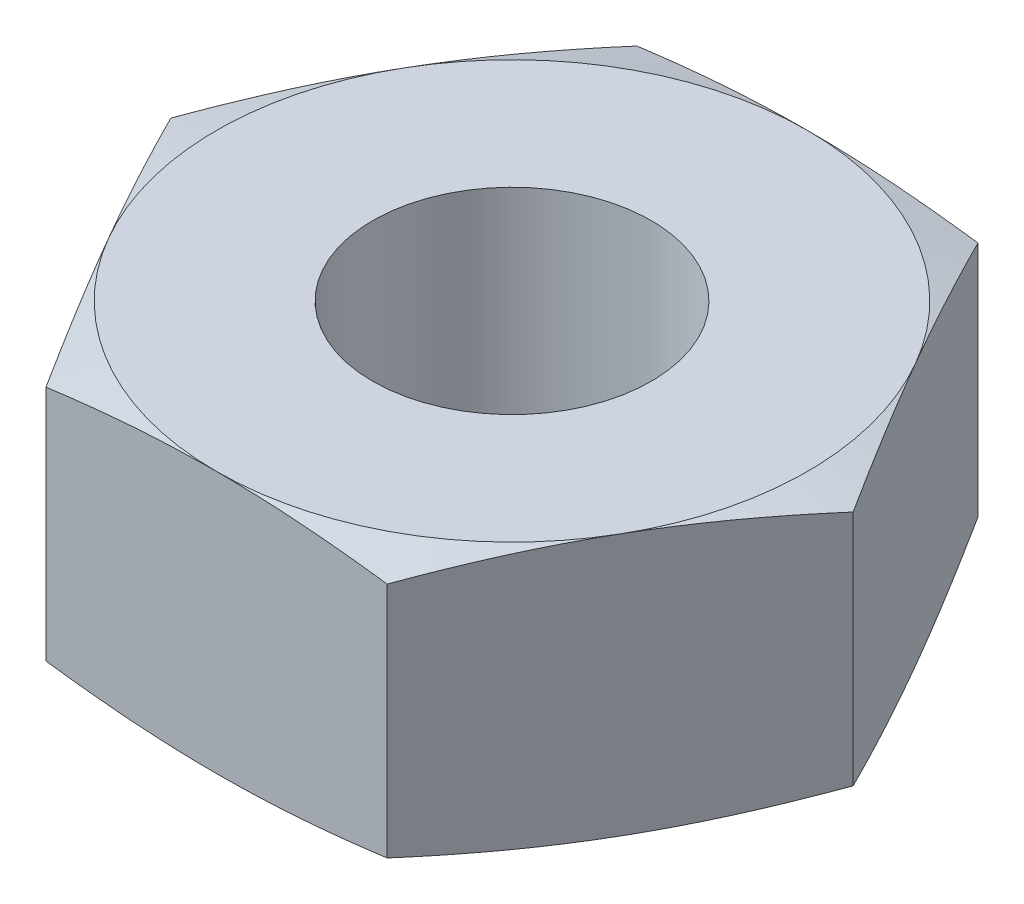
ISO-10303-21;
HEADER;
FILE_DESCRIPTION(('STEP AP214'),'2;1');
FILE_NAME('part.step','',(''),(''),'','','');
FILE_SCHEMA(('AUTOMOTIVE_DESIGN { 1 0 10303 214 1 1 1 1 }'));
ENDSEC;
DATA;
#1=APPLICATION_CONTEXT('core data for automotive mechanical design processes');
#2=APPLICATION_PROTOCOL_DEFINITION('international standard','automotive_design',2000,#1);
#3=PRODUCT_CONTEXT('',#1,'mechanical');
#4=PRODUCT('Part','Part','',(#3));
#5=PRODUCT_RELATED_PRODUCT_CATEGORY('part','',(#4));
#6=PRODUCT_DEFINITION_FORMATION('','',#4);
#7=PRODUCT_DEFINITION_CONTEXT('part definition',#1,'design');
#8=PRODUCT_DEFINITION('design','',#6,#7);
#9=PRODUCT_DEFINITION_SHAPE('','',#8);
#10=(LENGTH_UNIT() NAMED_UNIT(*) SI_UNIT(.MILLI.,.METRE.));
#11=(NAMED_UNIT(*) PLANE_ANGLE_UNIT() SI_UNIT($,.RADIAN.));
#12=(NAMED_UNIT(*) SI_UNIT($,.STERADIAN.) SOLID_ANGLE_UNIT());
#13=UNCERTAINTY_MEASURE_WITH_UNIT(LENGTH_MEASURE(1.E-05),#10,'distance_accuracy_value','');
#14=(GEOMETRIC_REPRESENTATION_CONTEXT(3) GLOBAL_UNCERTAINTY_ASSIGNED_CONTEXT((#13)) GLOBAL_UNIT_ASSIGNED_CONTEXT((#10,
#11,#12)) REPRESENTATION_CONTEXT('',''));
#15=CARTESIAN_POINT('',(0.,0.,0.));
#16=DIRECTION('',(0.,0.,1.));
#17=DIRECTION('',(1.,0.,0.));
#18=AXIS2_PLACEMENT_3D('',#15,#16,#17);
#19=CARTESIAN_POINT('',(0.,3.1,0.));
#20=DIRECTION('',(0.,1.,0.));
#21=DIRECTION('',(0.,0.,1.));
#22=AXIS2_PLACEMENT_3D('',#19,#20,#21);
#23=PLANE('',#22);
#24=CARTESIAN_POINT('',(0.,3.1,0.));
#25=DIRECTION('',(0.,1.,0.));
#26=DIRECTION('',(0.,0.,1.));
#27=AXIS2_PLACEMENT_3D('',#24,#25,#26);
#28=CIRCLE('',#27,1.64999999999999);
#29=CARTESIAN_POINT('',(0.,3.1,1.64999999999999));
#30=VERTEX_POINT('',#29);
#31=EDGE_CURVE('E259',#30,#30,#28,.T.);
#32=ORIENTED_EDGE('',*,*,#31,.F.);
#33=EDGE_LOOP('',(#32));
#34=FACE_BOUND('',#33,.T.);
#35=CARTESIAN_POINT('',(0.,3.1,0.));
#36=DIRECTION('',(0.,1.,0.));
#37=DIRECTION('',(0.,0.,1.));
#38=AXIS2_PLACEMENT_3D('',#35,#36,#37);
#39=CIRCLE('',#38,3.49999999999996);
#40=CARTESIAN_POINT('',(0.,3.1,3.49999999999996));
#41=VERTEX_POINT('',#40);
#42=CARTESIAN_POINT('',(-3.03108891324549,3.1,1.75));
#43=VERTEX_POINT('',#42);
#44=EDGE_CURVE('E11',#41,#43,#39,.F.);
#45=ORIENTED_EDGE('',*,*,#44,.F.);
#46=CARTESIAN_POINT('',(0.,3.1,0.));
#47=DIRECTION('',(0.,1.,0.));
#48=DIRECTION('',(0.,0.,1.));
#49=AXIS2_PLACEMENT_3D('',#46,#47,#48);
#50=CIRCLE('',#49,3.49999999999996);
#51=CARTESIAN_POINT('',(3.03108891324551,3.1,1.74999999999996));
#52=VERTEX_POINT('',#51);
#53=EDGE_CURVE('E158',#41,#52,#50,.T.);
#54=ORIENTED_EDGE('',*,*,#53,.T.);
#55=CARTESIAN_POINT('',(3.0310889132455,3.1,-1.74999999999998));
#56=VERTEX_POINT('',#55);
#57=EDGE_CURVE('E52',#56,#52,#39,.F.);
#58=ORIENTED_EDGE('',*,*,#57,.F.);
#59=CARTESIAN_POINT('',(0.,3.1,-3.49999999999996));
#60=VERTEX_POINT('',#59);
#61=EDGE_CURVE('E283',#60,#56,#39,.F.);
#62=ORIENTED_EDGE('',*,*,#61,.F.);
#63=CARTESIAN_POINT('',(-3.03108891324551,3.1,-1.74999999999996));
#64=VERTEX_POINT('',#63);
#65=EDGE_CURVE('E326',#64,#60,#39,.F.);
#66=ORIENTED_EDGE('',*,*,#65,.F.);
#67=EDGE_CURVE('E55',#43,#64,#39,.F.);
#68=ORIENTED_EDGE('',*,*,#67,.F.);
#69=EDGE_LOOP('',(#45,#54,#58,#62,#66,#68));
#70=FACE_BOUND('',#69,.T.);
#71=ADVANCED_FACE('F43',(#34,#70),#23,.T.);
#72=CARTESIAN_POINT('',(0.,0.,0.));
#73=DIRECTION('',(0.,1.,0.));
#74=DIRECTION('',(0.,0.,1.));
#75=AXIS2_PLACEMENT_3D('',#72,#73,#74);
#76=PLANE('',#75);
#77=CARTESIAN_POINT('',(0.,0.,0.));
#78=DIRECTION('',(0.,1.,0.));
#79=DIRECTION('',(0.,0.,1.));
#80=AXIS2_PLACEMENT_3D('',#77,#78,#79);
#81=CIRCLE('',#80,1.65);
#82=CARTESIAN_POINT('',(0.,0.,1.65));
#83=VERTEX_POINT('',#82);
#84=EDGE_CURVE('E265',#83,#83,#81,.T.);
#85=ORIENTED_EDGE('',*,*,#84,.T.);
#86=EDGE_LOOP('',(#85));
#87=FACE_BOUND('',#86,.T.);
#88=CARTESIAN_POINT('',(0.,0.,0.));
#89=DIRECTION('',(0.,1.,0.));
#90=DIRECTION('',(0.,0.,1.));
#91=AXIS2_PLACEMENT_3D('',#88,#89,#90);
#92=CIRCLE('',#91,3.49999999999996);
#93=CARTESIAN_POINT('',(0.,0.,3.49999999999996));
#94=VERTEX_POINT('',#93);
#95=CARTESIAN_POINT('',(3.03108891324551,0.,1.74999999999996));
#96=VERTEX_POINT('',#95);
#97=EDGE_CURVE('E151',#94,#96,#92,.T.);
#98=ORIENTED_EDGE('',*,*,#97,.F.);
#99=CARTESIAN_POINT('',(0.,0.,0.));
#100=DIRECTION('',(0.,1.,0.));
#101=DIRECTION('',(0.,0.,1.));
#102=AXIS2_PLACEMENT_3D('',#99,#100,#101);
#103=CIRCLE('',#102,3.49999999999996);
#104=CARTESIAN_POINT('',(-3.03108891324549,0.,1.75));
#105=VERTEX_POINT('',#104);
#106=EDGE_CURVE('E164',#94,#105,#103,.F.);
#107=ORIENTED_EDGE('',*,*,#106,.T.);
#108=CARTESIAN_POINT('',(-3.03108891324551,0.,-1.74999999999996));
#109=VERTEX_POINT('',#108);
#110=EDGE_CURVE('E279',#105,#109,#103,.F.);
#111=ORIENTED_EDGE('',*,*,#110,.T.);
#112=CARTESIAN_POINT('',(0.,0.,-3.49999999999996));
#113=VERTEX_POINT('',#112);
#114=EDGE_CURVE('E284',#109,#113,#103,.F.);
#115=ORIENTED_EDGE('',*,*,#114,.T.);
#116=CARTESIAN_POINT('',(3.0310889132455,0.,-1.74999999999998));
#117=VERTEX_POINT('',#116);
#118=EDGE_CURVE('E162',#113,#117,#103,.F.);
#119=ORIENTED_EDGE('',*,*,#118,.T.);
#120=EDGE_CURVE('E137',#117,#96,#103,.F.);
#121=ORIENTED_EDGE('',*,*,#120,.T.);
#122=EDGE_LOOP('',(#98,#107,#111,#115,#119,#121));
#123=FACE_BOUND('',#122,.T.);
#124=ADVANCED_FACE('F159',(#87,#123),#76,.F.);
#125=CARTESIAN_POINT('',(0.,3.1,0.));
#126=DIRECTION('',(0.,1.,0.));
#127=DIRECTION('',(0.,0.,1.));
#128=AXIS2_PLACEMENT_3D('',#125,#126,#127);
#129=CYLINDRICAL_SURFACE('',#128,1.64999999999999);
#130=ORIENTED_EDGE('',*,*,#84,.F.);
#131=EDGE_LOOP('',(#130));
#132=FACE_BOUND('',#131,.T.);
#133=ORIENTED_EDGE('',*,*,#31,.T.);
#134=EDGE_LOOP('',(#133));
#135=FACE_BOUND('',#134,.T.);
#136=ADVANCED_FACE('F194',(#132,#135),#129,.F.);
#137=CARTESIAN_POINT('',(0.,0.,0.));
#138=DIRECTION('',(0.,1.,0.));
#139=DIRECTION('',(0.,0.,1.));
#140=AXIS2_PLACEMENT_3D('',#137,#138,#139);
#141=CONICAL_SURFACE('',#140,3.49999999999996,1.30899693899574);
#142=CARTESIAN_POINT('',(-6.06936230178933,0.939489583560413,3.50000000000004));
#143=CARTESIAN_POINT('',(-5.92224769274745,0.905344318494395,3.50000000000004));
#144=CARTESIAN_POINT('',(-5.77506619218543,0.871486976113389,3.50000000000004));
#145=CARTESIAN_POINT('',(-5.48054165265175,0.804471372598283,3.50000000000004));
#146=CARTESIAN_POINT('',(-5.33319861103691,0.771313123088021,3.50000000000003));
#147=CARTESIAN_POINT('',(-4.89083417403673,0.673060526400826,3.50000000000003));
#148=CARTESIAN_POINT('',(-4.59553602106016,0.609202024899264,3.50000000000003));
#149=CARTESIAN_POINT('',(-4.00119204225972,0.485690742503001,3.50000000000002));
#150=CARTESIAN_POINT('',(-3.70213686331737,0.426082473534192,3.50000000000002));
#151=CARTESIAN_POINT('',(-3.10262873214497,0.314105604446441,3.50000000000001));
#152=CARTESIAN_POINT('',(-2.80217566358384,0.261737618413204,3.50000000000001));
#153=CARTESIAN_POINT('',(-2.20761813128422,0.169129619955442,3.5));
#154=CARTESIAN_POINT('',(-1.9135604689667,0.128601099741144,3.5));
#155=CARTESIAN_POINT('',(-1.47125654963096,0.0788585917058612,3.49999999999999));
#156=CARTESIAN_POINT('',(-1.32363227147206,0.0641202924406588,3.49999999999999));
#157=CARTESIAN_POINT('',(-1.02802479009862,0.0388962059702481,3.49999999999999));
#158=CARTESIAN_POINT('',(-0.880041612260892,0.028410126441191,3.49999999999999));
#159=CARTESIAN_POINT('',(-0.584449855969166,0.0121988349986269,3.49999999999999));
#160=CARTESIAN_POINT('',(-0.436842406962712,0.00645332437112175,3.49999999999998));
#161=CARTESIAN_POINT('',(-0.141516452491127,-6.21610861985006E-05,3.49999999999998));
#162=CARTESIAN_POINT('',(0.00620205248960651,-0.000832157493449603,3.49999999999998));
#163=CARTESIAN_POINT('',(0.301590554005556,0.00264446135592434,3.49999999999998));
#164=CARTESIAN_POINT('',(0.449260545979386,0.00689145940010209,3.49999999999998));
#165=CARTESIAN_POINT('',(0.744379521136856,0.0201822690380688,3.49999999999997));
#166=CARTESIAN_POINT('',(0.891828504561848,0.0292260753896956,3.49999999999997));
#167=CARTESIAN_POINT('',(1.24925494939193,0.056485064839163,3.49999999999997));
#168=CARTESIAN_POINT('',(1.45905949358602,0.076967211157635,3.49999999999996));
#169=CARTESIAN_POINT('',(1.87779262285002,0.12524039519469,3.49999999999996));
#170=CARTESIAN_POINT('',(2.0867212428909,0.1530311382419,3.49999999999996));
#171=CARTESIAN_POINT('',(2.50437827739807,0.214400079258007,3.49999999999995));
#172=CARTESIAN_POINT('',(2.71310404792876,0.247996009355105,3.49999999999995));
#173=CARTESIAN_POINT('',(3.12980884372102,0.319545462621682,3.49999999999995));
#174=CARTESIAN_POINT('',(3.33778783203112,0.357499198436848,3.49999999999995));
#175=CARTESIAN_POINT('',(3.75735674163426,0.437505770709711,3.49999999999994));
#176=CARTESIAN_POINT('',(3.96893361460638,0.47962651693829,3.49999999999994));
#177=CARTESIAN_POINT('',(4.39155544327137,0.566454026690071,3.49999999999993));
#178=CARTESIAN_POINT('',(4.60260039313308,0.611160818434961,3.49999999999993));
#179=CARTESIAN_POINT('',(5.02313048588161,0.702293378803934,3.49999999999993));
#180=CARTESIAN_POINT('',(5.23261791923147,0.748708627882237,3.49999999999993));
#181=CARTESIAN_POINT('',(5.65123489196765,0.843061271383624,3.49999999999992));
#182=CARTESIAN_POINT('',(5.86036445530282,0.890998559388443,3.49999999999992));
#183=CARTESIAN_POINT('',(6.0693623017894,0.939489583560413,3.49999999999992));
#184=B_SPLINE_CURVE_WITH_KNOTS('',3,(#142,#143,#144,#145,#146,#147,#148,#149,#150,#151,#152,
#153,#154,#155,#156,#157,#158,#159,#160,#161,#162,#163,#164,#165,#166,#167,#168,#169,#170,#171,
#172,#173,#174,#175,#176,#177,#178,#179,#180,#181,#182,#183),.UNSPECIFIED.,.F.,.F.,(4,2,2,2,2,2,
2,2,2,2,2,2,2,2,2,2,2,2,2,2,4),(0.,0.453075080699115,0.906157688759068,1.81250329996458,
2.72725701533054,3.64208826814007,4.53229490655777,4.97731857908019,5.42231165273799,
5.86538926771751,6.30846496119006,6.7515744627158,7.19468347999309,7.82691859199109,
8.45912821714922,9.09330423248992,9.72751120656554,10.3746766371492,11.0218491316251,
11.6655464761794,12.3091989132365),.UNSPECIFIED.);
#185=CARTESIAN_POINT('',(2.02072594216372,0.145081595145839,3.49999999999996));
#186=VERTEX_POINT('',#185);
#187=EDGE_CURVE('E152',#94,#186,#184,.T.);
#188=ORIENTED_EDGE('',*,*,#187,.F.);
#189=ORIENTED_EDGE('',*,*,#97,.T.);
#190=CARTESIAN_POINT('',(2.02061047210988,0.145112536579482,3.50019999999996));
#191=CARTESIAN_POINT('',(2.10453570366725,0.122614406177996,3.35483723490561));
#192=CARTESIAN_POINT('',(2.18861311055534,0.102189745494032,3.20921089440679));
#193=CARTESIAN_POINT('',(2.35706487716361,0.0663054466052739,2.91744387601653));
#194=CARTESIAN_POINT('',(2.44143934349253,0.0508478254944838,2.77130301347333));
#195=CARTESIAN_POINT('',(2.60997361780492,0.025800087746425,2.47939308754753));
#196=CARTESIAN_POINT('',(2.69413228593379,0.0161800979095285,2.333625998451));
#197=CARTESIAN_POINT('',(2.86255695641053,0.00328066753314792,2.04190591193723));
#198=CARTESIAN_POINT('',(2.94682293482803,0.,1.89595295596861));
#199=CARTESIAN_POINT('',(3.11535489166305,0.,1.60404704403135));
#200=CARTESIAN_POINT('',(3.19962087008056,0.00328066753314791,1.45809408806273));
#201=CARTESIAN_POINT('',(3.36804554055729,0.0161800979095285,1.16637400154896));
#202=CARTESIAN_POINT('',(3.45220420868616,0.0258000877464251,1.02060691245243));
#203=CARTESIAN_POINT('',(3.62073848299855,0.0508478254944839,0.728696986526628));
#204=CARTESIAN_POINT('',(3.70511294932747,0.0663054466052739,0.582556123983431));
#205=CARTESIAN_POINT('',(3.87356471593574,0.102189745494032,0.290789105593169));
#206=CARTESIAN_POINT('',(3.95764212282383,0.122614406177996,0.145162765094345));
#207=CARTESIAN_POINT('',(4.0415673543812,0.145112536579482,-0.000200000000000002));
#208=B_SPLINE_CURVE_WITH_KNOTS('',3,(#190,#191,#192,#193,#194,#195,#196,#197,#198,#199,#200,
#201,#202,#203,#204,#205,#206,#207),.UNSPECIFIED.,.F.,.F.,(4,2,2,2,2,2,2,2,4),(0.,
0.508081243376826,1.01636855642798,1.52203235492773,2.02759827097031,2.53316418701288,
3.03882798551263,3.54711529856379,4.05519654194061),.UNSPECIFIED.);
#209=EDGE_CURVE('E148',#186,#96,#208,.T.);
#210=ORIENTED_EDGE('',*,*,#209,.F.);
#211=EDGE_LOOP('',(#188,#189,#210));
#212=FACE_BOUND('',#211,.T.);
#213=ADVANCED_FACE('F155',(#212),#141,.T.);
#214=ORIENTED_EDGE('',*,*,#120,.F.);
#215=CARTESIAN_POINT('',(4.0415673543812,0.145112536579482,0.000200000000000051));
#216=CARTESIAN_POINT('',(3.95764212282383,0.122614406177995,-0.145162765094346));
#217=CARTESIAN_POINT('',(3.87356471593573,0.102189745494031,-0.290789105593172));
#218=CARTESIAN_POINT('',(3.70511294932746,0.0663054466052719,-0.582556123983436));
#219=CARTESIAN_POINT('',(3.62073848299854,0.0508478254944814,-0.728696986526634));
#220=CARTESIAN_POINT('',(3.45220420868615,0.025800087746422,-1.02060691245244));
#221=CARTESIAN_POINT('',(3.36804554055728,0.0161800979095252,-1.16637400154897));
#222=CARTESIAN_POINT('',(3.19962087008053,0.00328066753314432,-1.45809408806274));
#223=CARTESIAN_POINT('',(3.11535489166303,0.,-1.60404704403137));
#224=CARTESIAN_POINT('',(2.94682293482801,0.,-1.89595295596862));
#225=CARTESIAN_POINT('',(2.8625569564105,0.0032806675331443,-2.04190591193725));
#226=CARTESIAN_POINT('',(2.69413228593375,0.0161800979095252,-2.33362599845101));
#227=CARTESIAN_POINT('',(2.60997361780488,0.025800087746422,-2.47939308754755));
#228=CARTESIAN_POINT('',(2.44143934349249,0.0508478254944814,-2.77130301347335));
#229=CARTESIAN_POINT('',(2.35706487716357,0.066305446605272,-2.91744387601655));
#230=CARTESIAN_POINT('',(2.1886131105553,0.102189745494031,-3.20921089440682));
#231=CARTESIAN_POINT('',(2.1045357036672,0.122614406177995,-3.35483723490564));
#232=CARTESIAN_POINT('',(2.02061047210983,0.145112536579482,-3.50019999999999));
#233=B_SPLINE_CURVE_WITH_KNOTS('',3,(#215,#216,#217,#218,#219,#220,#221,#222,#223,#224,#225,
#226,#227,#228,#229,#230,#231,#232),.UNSPECIFIED.,.F.,.F.,(4,2,2,2,2,2,2,2,4),(0.,
0.508081243376832,1.01636855642799,1.52203235492775,2.02759827097033,2.53316418701291,
3.03882798551267,3.54711529856383,4.05519654194066),.UNSPECIFIED.);
#234=CARTESIAN_POINT('',(4.04145188432736,0.145081595145839,0.));
#235=VERTEX_POINT('',#234);
#236=EDGE_CURVE('E143',#235,#117,#233,.T.);
#237=ORIENTED_EDGE('',*,*,#236,.F.);
#238=EDGE_CURVE('E135',#96,#235,#208,.T.);
#239=ORIENTED_EDGE('',*,*,#238,.F.);
#240=EDGE_LOOP('',(#214,#237,#239));
#241=FACE_BOUND('',#240,.T.);
#242=ADVANCED_FACE('F136',(#241),#141,.T.);
#243=ORIENTED_EDGE('',*,*,#118,.F.);
#244=CARTESIAN_POINT('',(6.06936230178935,0.939489583560413,-3.5));
#245=CARTESIAN_POINT('',(5.92224769274747,0.905344318494396,-3.5));
#246=CARTESIAN_POINT('',(5.77506619218546,0.871486976113389,-3.5));
#247=CARTESIAN_POINT('',(5.48054165265177,0.804471372598283,-3.5));
#248=CARTESIAN_POINT('',(5.33319861103694,0.771313123088021,-3.5));
#249=CARTESIAN_POINT('',(4.89083417403676,0.673060526400826,-3.5));
#250=CARTESIAN_POINT('',(4.59553602106018,0.609202024899264,-3.5));
#251=CARTESIAN_POINT('',(4.00119204225974,0.485690742503002,-3.49999999999999));
#252=CARTESIAN_POINT('',(3.7021368633174,0.426082473534193,-3.49999999999999));
#253=CARTESIAN_POINT('',(3.102628732145,0.314105604446442,-3.49999999999999));
#254=CARTESIAN_POINT('',(2.80217566358387,0.261737618413204,-3.49999999999999));
#255=CARTESIAN_POINT('',(2.20761813128425,0.169129619955442,-3.49999999999999));
#256=CARTESIAN_POINT('',(1.91356046896673,0.128601099741144,-3.49999999999999));
#257=CARTESIAN_POINT('',(1.47125654963098,0.0788585917058615,-3.49999999999999));
#258=CARTESIAN_POINT('',(1.32363227147209,0.0641202924406591,-3.49999999999998));
#259=CARTESIAN_POINT('',(1.02802479009864,0.0388962059702484,-3.49999999999998));
#260=CARTESIAN_POINT('',(0.880041612260917,0.0284101264411912,-3.49999999999998));
#261=CARTESIAN_POINT('',(0.584449855969191,0.012198834998627,-3.49999999999998));
#262=CARTESIAN_POINT('',(0.436842406962736,0.00645332437112183,-3.49999999999998));
#263=CARTESIAN_POINT('',(0.141516452491151,-6.21610861983845E-05,-3.49999999999998));
#264=CARTESIAN_POINT('',(-0.00620205248958201,-0.000832157493449399,-3.49999999999998));
#265=CARTESIAN_POINT('',(-0.301590554005532,0.0026444613559246,-3.49999999999998));
#266=CARTESIAN_POINT('',(-0.449260545979362,0.00689145940010233,-3.49999999999998));
#267=CARTESIAN_POINT('',(-0.744379521136833,0.020182269038069,-3.49999999999998));
#268=CARTESIAN_POINT('',(-0.891828504561824,0.0292260753896958,-3.49999999999998));
#269=CARTESIAN_POINT('',(-1.24925494939191,0.0564850648391631,-3.49999999999998));
#270=CARTESIAN_POINT('',(-1.45905949358599,0.076967211157635,-3.49999999999998));
#271=CARTESIAN_POINT('',(-1.87779262284999,0.125240395194691,-3.49999999999997));
#272=CARTESIAN_POINT('',(-2.08672124289087,0.153031138241901,-3.49999999999997));
#273=CARTESIAN_POINT('',(-2.50437827739804,0.214400079258007,-3.49999999999997));
#274=CARTESIAN_POINT('',(-2.71310404792874,0.247996009355105,-3.49999999999997));
#275=CARTESIAN_POINT('',(-3.129808843721,0.319545462621682,-3.49999999999997));
#276=CARTESIAN_POINT('',(-3.33778783203109,0.357499198436848,-3.49999999999997));
#277=CARTESIAN_POINT('',(-3.75735674163423,0.437505770709712,-3.49999999999997));
#278=CARTESIAN_POINT('',(-3.96893361460636,0.47962651693829,-3.49999999999997));
#279=CARTESIAN_POINT('',(-4.39155544327135,0.566454026690071,-3.49999999999997));
#280=CARTESIAN_POINT('',(-4.60260039313306,0.611160818434961,-3.49999999999996));
#281=CARTESIAN_POINT('',(-5.02313048588159,0.702293378803933,-3.49999999999996));
#282=CARTESIAN_POINT('',(-5.23261791923145,0.748708627882236,-3.49999999999996));
#283=CARTESIAN_POINT('',(-5.65123489196763,0.843061271383625,-3.49999999999996));
#284=CARTESIAN_POINT('',(-5.86036445530279,0.890998559388444,-3.49999999999996));
#285=CARTESIAN_POINT('',(-6.06936230178938,0.939489583560413,-3.49999999999996));
#286=B_SPLINE_CURVE_WITH_KNOTS('',3,(#244,#245,#246,#247,#248,#249,#250,#251,#252,#253,#254,
#255,#256,#257,#258,#259,#260,#261,#262,#263,#264,#265,#266,#267,#268,#269,#270,#271,#272,#273,
#274,#275,#276,#277,#278,#279,#280,#281,#282,#283,#284,#285),.UNSPECIFIED.,.F.,.F.,(4,2,2,2,2,2,
2,2,2,2,2,2,2,2,2,2,2,2,2,2,4),(0.,0.453075080699114,0.906157688759067,1.81250329996458,
2.72725701533054,3.64208826814007,4.53229490655777,4.97731857908019,5.42231165273799,
5.86538926771751,6.30846496119006,6.7515744627158,7.19468347999309,7.82691859199109,
8.45912821714922,9.09330423248992,9.72751120656554,10.3746766371492,11.0218491316251,
11.6655464761794,12.3091989132365),.UNSPECIFIED.);
#287=CARTESIAN_POINT('',(2.02072594216367,0.145081595145839,-3.49999999999999));
#288=VERTEX_POINT('',#287);
#289=EDGE_CURVE('E235',#288,#113,#286,.T.);
#290=ORIENTED_EDGE('',*,*,#289,.F.);
#291=EDGE_CURVE('E179',#117,#288,#233,.T.);
#292=ORIENTED_EDGE('',*,*,#291,.F.);
#293=EDGE_LOOP('',(#243,#290,#292));
#294=FACE_BOUND('',#293,.T.);
#295=ADVANCED_FACE('F348',(#294),#141,.T.);
#296=ORIENTED_EDGE('',*,*,#114,.F.);
#297=CARTESIAN_POINT('',(-2.02061047210986,0.145112536579482,-3.50019999999997));
#298=CARTESIAN_POINT('',(-2.10453570366723,0.122614406177996,-3.35483723490563));
#299=CARTESIAN_POINT('',(-2.18861311055532,0.102189745494031,-3.2092108944068));
#300=CARTESIAN_POINT('',(-2.35706487716359,0.066305446605272,-2.91744387601654));
#301=CARTESIAN_POINT('',(-2.44143934349251,0.0508478254944814,-2.77130301347334));
#302=CARTESIAN_POINT('',(-2.6099736178049,0.0258000877464219,-2.47939308754753));
#303=CARTESIAN_POINT('',(-2.69413228593377,0.0161800979095251,-2.333625998451));
#304=CARTESIAN_POINT('',(-2.86255695641051,0.00328066753314416,-2.04190591193723));
#305=CARTESIAN_POINT('',(-2.94682293482802,0.,-1.8959529559686));
#306=CARTESIAN_POINT('',(-3.11535489166304,0.,-1.60404704403134));
#307=CARTESIAN_POINT('',(-3.19962087008054,0.00328066753314411,-1.45809408806272));
#308=CARTESIAN_POINT('',(-3.36804554055729,0.016180097909525,-1.16637400154895));
#309=CARTESIAN_POINT('',(-3.45220420868616,0.0258000877464219,-1.02060691245242));
#310=CARTESIAN_POINT('',(-3.62073848299854,0.0508478254944813,-0.728696986526609));
#311=CARTESIAN_POINT('',(-3.70511294932746,0.0663054466052719,-0.58255612398341));
#312=CARTESIAN_POINT('',(-3.87356471593573,0.102189745494031,-0.290789105593145));
#313=CARTESIAN_POINT('',(-3.95764212282383,0.122614406177995,-0.145162765094319));
#314=CARTESIAN_POINT('',(-4.0415673543812,0.145112536579482,0.000200000000027788));
#315=B_SPLINE_CURVE_WITH_KNOTS('',3,(#297,#298,#299,#300,#301,#302,#303,#304,#305,#306,#307,
#308,#309,#310,#311,#312,#313,#314),.UNSPECIFIED.,.F.,.F.,(4,2,2,2,2,2,2,2,4),(0.,
0.508081243376832,1.01636855642799,1.52203235492775,2.02759827097033,2.53316418701291,
3.03882798551267,3.54711529856383,4.05519654194066),.UNSPECIFIED.);
#316=CARTESIAN_POINT('',(-2.0207259421637,0.145081595145839,-3.49999999999997));
#317=VERTEX_POINT('',#316);
#318=EDGE_CURVE('E232',#317,#109,#315,.T.);
#319=ORIENTED_EDGE('',*,*,#318,.F.);
#320=EDGE_CURVE('E223',#113,#317,#286,.T.);
#321=ORIENTED_EDGE('',*,*,#320,.F.);
#322=EDGE_LOOP('',(#296,#319,#321));
#323=FACE_BOUND('',#322,.T.);
#324=ADVANCED_FACE('F349',(#323),#141,.T.);
#325=ORIENTED_EDGE('',*,*,#110,.F.);
#326=CARTESIAN_POINT('',(-4.0415673543812,0.145112536579481,-0.000199999999971832));
#327=CARTESIAN_POINT('',(-3.95764212282383,0.122614406177995,0.145162765094373));
#328=CARTESIAN_POINT('',(-3.87356471593573,0.102189745494031,0.290789105593199));
#329=CARTESIAN_POINT('',(-3.70511294932745,0.0663054466052719,0.582556123983461));
#330=CARTESIAN_POINT('',(-3.62073848299853,0.0508478254944813,0.728696986526659));
#331=CARTESIAN_POINT('',(-3.45220420868614,0.0258000877464218,1.02060691245247));
#332=CARTESIAN_POINT('',(-3.36804554055727,0.016180097909525,1.166374001549));
#333=CARTESIAN_POINT('',(-3.19962087008052,0.00328066753314409,1.45809408806276));
#334=CARTESIAN_POINT('',(-3.11535489166301,0.,1.60404704403139));
#335=CARTESIAN_POINT('',(-2.94682293482799,0.,1.89595295596864));
#336=CARTESIAN_POINT('',(-2.86255695641048,0.00328066753314409,2.04190591193727));
#337=CARTESIAN_POINT('',(-2.69413228593374,0.016180097909525,2.33362599845103));
#338=CARTESIAN_POINT('',(-2.60997361780487,0.0258000877464219,2.47939308754756));
#339=CARTESIAN_POINT('',(-2.44143934349247,0.0508478254944814,2.77130301347337));
#340=CARTESIAN_POINT('',(-2.35706487716355,0.0663054466052719,2.91744387601657));
#341=CARTESIAN_POINT('',(-2.18861311055528,0.102189745494031,3.20921089440683));
#342=CARTESIAN_POINT('',(-2.10453570366718,0.122614406177995,3.35483723490566));
#343=CARTESIAN_POINT('',(-2.02061047210981,0.145112536579482,3.5002));
#344=B_SPLINE_CURVE_WITH_KNOTS('',3,(#326,#327,#328,#329,#330,#331,#332,#333,#334,#335,#336,
#337,#338,#339,#340,#341,#342,#343),.UNSPECIFIED.,.F.,.F.,(4,2,2,2,2,2,2,2,4),(0.,
0.508081243376832,1.01636855642799,1.52203235492775,2.02759827097033,2.53316418701291,
3.03882798551267,3.54711529856383,4.05519654194066),.UNSPECIFIED.);
#345=CARTESIAN_POINT('',(-4.04145188432736,0.145081595145839,0.));
#346=VERTEX_POINT('',#345);
#347=EDGE_CURVE('E350',#346,#105,#344,.T.);
#348=ORIENTED_EDGE('',*,*,#347,.F.);
#349=EDGE_CURVE('E218',#109,#346,#315,.T.);
#350=ORIENTED_EDGE('',*,*,#349,.F.);
#351=EDGE_LOOP('',(#325,#348,#350));
#352=FACE_BOUND('',#351,.T.);
#353=ADVANCED_FACE('F356',(#352),#141,.T.);
#354=ORIENTED_EDGE('',*,*,#106,.F.);
#355=CARTESIAN_POINT('',(-2.02072594216365,0.145081595145839,3.5));
#356=VERTEX_POINT('',#355);
#357=EDGE_CURVE('E344',#356,#94,#184,.T.);
#358=ORIENTED_EDGE('',*,*,#357,.F.);
#359=EDGE_CURVE('E211',#105,#356,#344,.T.);
#360=ORIENTED_EDGE('',*,*,#359,.F.);
#361=EDGE_LOOP('',(#354,#358,#360));
#362=FACE_BOUND('',#361,.T.);
#363=ADVANCED_FACE('F198',(#362),#141,.T.);
#364=CARTESIAN_POINT('',(0.,2.86229508922613,0.));
#365=DIRECTION('',(0.,-1.,0.));
#366=DIRECTION('',(0.,0.,-1.));
#367=AXIS2_PLACEMENT_3D('',#364,#365,#366);
#368=CONICAL_SURFACE('',#367,4.38712680421667,1.30899693899574);
#369=ORIENTED_EDGE('',*,*,#53,.F.);
#370=CARTESIAN_POINT('',(6.0693623017894,2.16051041643959,3.49999999999992));
#371=CARTESIAN_POINT('',(5.92224769274752,2.1946556815056,3.49999999999992));
#372=CARTESIAN_POINT('',(5.77506619218551,2.22851302388661,3.49999999999992));
#373=CARTESIAN_POINT('',(5.48054165265182,2.29552862740172,3.49999999999992));
#374=CARTESIAN_POINT('',(5.33319861103698,2.32868687691198,3.49999999999992));
#375=CARTESIAN_POINT('',(4.89083417403681,2.42693947359917,3.49999999999993));
#376=CARTESIAN_POINT('',(4.59553602106023,2.49079797510074,3.49999999999993));
#377=CARTESIAN_POINT('',(4.00119204225979,2.614309257497,3.49999999999994));
#378=CARTESIAN_POINT('',(3.70213686331745,2.67391752646581,3.49999999999994));
#379=CARTESIAN_POINT('',(3.10262873214505,2.78589439555356,3.49999999999995));
#380=CARTESIAN_POINT('',(2.80217566358392,2.8382623815868,3.49999999999995));
#381=CARTESIAN_POINT('',(2.20761813128429,2.93087038004456,3.49999999999996));
#382=CARTESIAN_POINT('',(1.91356046896678,2.97139890025886,3.49999999999996));
#383=CARTESIAN_POINT('',(1.47125654963103,3.02114140829414,3.49999999999996));
#384=CARTESIAN_POINT('',(1.32363227147213,3.03587970755934,3.49999999999997));
#385=CARTESIAN_POINT('',(1.02802479009869,3.06110379402975,3.49999999999997));
#386=CARTESIAN_POINT('',(0.880041612260965,3.07158987355881,3.49999999999997));
#387=CARTESIAN_POINT('',(0.584449855969238,3.08780116500137,3.49999999999997));
#388=CARTESIAN_POINT('',(0.436842406962784,3.09354667562888,3.49999999999998));
#389=CARTESIAN_POINT('',(0.141516452491198,3.1000621610862,3.49999999999998));
#390=CARTESIAN_POINT('',(-0.00620205248953463,3.10083215749345,3.49999999999998));
#391=CARTESIAN_POINT('',(-0.301590554005485,3.09735553864408,3.49999999999998));
#392=CARTESIAN_POINT('',(-0.449260545979314,3.0931085405999,3.49999999999998));
#393=CARTESIAN_POINT('',(-0.744379521136785,3.07981773096193,3.49999999999999));
#394=CARTESIAN_POINT('',(-0.891828504561777,3.07077392461031,3.49999999999999));
#395=CARTESIAN_POINT('',(-1.24925494939186,3.04351493516084,3.49999999999999));
#396=CARTESIAN_POINT('',(-1.45905949358595,3.02303278884237,3.49999999999999));
#397=CARTESIAN_POINT('',(-1.87779262284994,2.97475960480531,3.5));
#398=CARTESIAN_POINT('',(-2.08672124289082,2.9469688617581,3.5));
#399=CARTESIAN_POINT('',(-2.50437827739799,2.88559992074199,3.50000000000001));
#400=CARTESIAN_POINT('',(-2.71310404792869,2.8520039906449,3.50000000000001));
#401=CARTESIAN_POINT('',(-3.12980884372095,2.78045453737832,3.50000000000001));
#402=CARTESIAN_POINT('',(-3.33778783203105,2.74250080156315,3.50000000000001));
#403=CARTESIAN_POINT('',(-3.75735674163418,2.66249422929029,3.50000000000002));
#404=CARTESIAN_POINT('',(-3.96893361460631,2.62037348306171,3.50000000000002));
#405=CARTESIAN_POINT('',(-4.3915554432713,2.53354597330993,3.50000000000002));
#406=CARTESIAN_POINT('',(-4.60260039313301,2.48883918156504,3.50000000000003));
#407=CARTESIAN_POINT('',(-5.02313048588154,2.39770662119607,3.50000000000003));
#408=CARTESIAN_POINT('',(-5.2326179192314,2.35129137211776,3.50000000000003));
#409=CARTESIAN_POINT('',(-5.65123489196758,2.25693872861638,3.50000000000004));
#410=CARTESIAN_POINT('',(-5.86036445530274,2.20900144061156,3.50000000000004));
#411=CARTESIAN_POINT('',(-6.06936230178933,2.16051041643959,3.50000000000004));
#412=B_SPLINE_CURVE_WITH_KNOTS('',3,(#370,#371,#372,#373,#374,#375,#376,#377,#378,#379,#380,
#381,#382,#383,#384,#385,#386,#387,#388,#389,#390,#391,#392,#393,#394,#395,#396,#397,#398,#399,
#400,#401,#402,#403,#404,#405,#406,#407,#408,#409,#410,#411),.UNSPECIFIED.,.F.,.F.,(4,2,2,2,2,2,
2,2,2,2,2,2,2,2,2,2,2,2,2,2,4),(0.,0.453075080699114,0.906157688759067,1.81250329996458,
2.72725701533054,3.64208826814007,4.53229490655777,4.97731857908019,5.42231165273799,
5.86538926771751,6.30846496119006,6.75157446271581,7.19468347999309,7.82691859199109,
8.45912821714922,9.09330423248992,9.72751120656554,10.3746766371492,11.0218491316251,
11.6655464761794,12.3091989132365),.UNSPECIFIED.);
#413=CARTESIAN_POINT('',(2.02072594216372,2.95491840485416,3.49999999999996));
#414=VERTEX_POINT('',#413);
#415=EDGE_CURVE('E174',#414,#41,#412,.T.);
#416=ORIENTED_EDGE('',*,*,#415,.F.);
#417=CARTESIAN_POINT('',(4.0415673543812,2.95488746342052,-0.0002));
#418=CARTESIAN_POINT('',(3.95764212282383,2.977385593822,0.145162765094345));
#419=CARTESIAN_POINT('',(3.87356471593574,2.99781025450597,0.290789105593169));
#420=CARTESIAN_POINT('',(3.70511294932747,3.03369455339473,0.582556123983431));
#421=CARTESIAN_POINT('',(3.62073848299855,3.04915217450552,0.728696986526628));
#422=CARTESIAN_POINT('',(3.45220420868616,3.07419991225358,1.02060691245243));
#423=CARTESIAN_POINT('',(3.36804554055729,3.08381990209047,1.16637400154896));
#424=CARTESIAN_POINT('',(3.19962087008056,3.09671933246685,1.45809408806272));
#425=CARTESIAN_POINT('',(3.11535489166305,3.09999999999999,1.60404704403135));
#426=CARTESIAN_POINT('',(2.94682293482803,3.09999999999999,1.89595295596861));
#427=CARTESIAN_POINT('',(2.86255695641053,3.09671933246685,2.04190591193723));
#428=CARTESIAN_POINT('',(2.69413228593379,3.08381990209047,2.333625998451));
#429=CARTESIAN_POINT('',(2.60997361780492,3.07419991225358,2.47939308754753));
#430=CARTESIAN_POINT('',(2.44143934349253,3.04915217450552,2.77130301347333));
#431=CARTESIAN_POINT('',(2.35706487716361,3.03369455339473,2.91744387601653));
#432=CARTESIAN_POINT('',(2.18861311055535,2.99781025450597,3.20921089440679));
#433=CARTESIAN_POINT('',(2.10453570366725,2.97738559382201,3.35483723490561));
#434=CARTESIAN_POINT('',(2.02061047210988,2.95488746342052,3.50019999999996));
#435=B_SPLINE_CURVE_WITH_KNOTS('',3,(#417,#418,#419,#420,#421,#422,#423,#424,#425,#426,#427,
#428,#429,#430,#431,#432,#433,#434),.UNSPECIFIED.,.F.,.F.,(4,2,2,2,2,2,2,2,4),(0.,
0.508081243376826,1.01636855642798,1.52203235492773,2.02759827097031,2.53316418701288,
3.03882798551263,3.54711529856379,4.05519654194061),.UNSPECIFIED.);
#436=EDGE_CURVE('E297',#52,#414,#435,.T.);
#437=ORIENTED_EDGE('',*,*,#436,.F.);
#438=EDGE_LOOP('',(#369,#416,#437));
#439=FACE_BOUND('',#438,.T.);
#440=ADVANCED_FACE('F331',(#439),#368,.T.);
#441=ORIENTED_EDGE('',*,*,#57,.T.);
#442=CARTESIAN_POINT('',(4.04145188432736,2.95491840485416,0.));
#443=VERTEX_POINT('',#442);
#444=EDGE_CURVE('E298',#443,#52,#435,.T.);
#445=ORIENTED_EDGE('',*,*,#444,.F.);
#446=CARTESIAN_POINT('',(2.02061047210983,2.95488746342052,-3.50019999999999));
#447=CARTESIAN_POINT('',(2.1045357036672,2.97738559382201,-3.35483723490564));
#448=CARTESIAN_POINT('',(2.1886131105553,2.99781025450597,-3.20921089440682));
#449=CARTESIAN_POINT('',(2.35706487716357,3.03369455339473,-2.91744387601655));
#450=CARTESIAN_POINT('',(2.44143934349249,3.04915217450552,-2.77130301347335));
#451=CARTESIAN_POINT('',(2.60997361780488,3.07419991225358,-2.47939308754755));
#452=CARTESIAN_POINT('',(2.69413228593375,3.08381990209048,-2.33362599845102));
#453=CARTESIAN_POINT('',(2.8625569564105,3.09671933246686,-2.04190591193725));
#454=CARTESIAN_POINT('',(2.94682293482801,3.1,-1.89595295596862));
#455=CARTESIAN_POINT('',(3.11535489166303,3.1,-1.60404704403136));
#456=CARTESIAN_POINT('',(3.19962087008053,3.09671933246686,-1.45809408806274));
#457=CARTESIAN_POINT('',(3.36804554055728,3.08381990209048,-1.16637400154897));
#458=CARTESIAN_POINT('',(3.45220420868615,3.07419991225358,-1.02060691245244));
#459=CARTESIAN_POINT('',(3.62073848299854,3.04915217450552,-0.728696986526634));
#460=CARTESIAN_POINT('',(3.70511294932746,3.03369455339473,-0.582556123983435));
#461=CARTESIAN_POINT('',(3.87356471593573,2.99781025450597,-0.290789105593171));
#462=CARTESIAN_POINT('',(3.95764212282383,2.97738559382201,-0.145162765094346));
#463=CARTESIAN_POINT('',(4.0415673543812,2.95488746342052,0.000200000000000451));
#464=B_SPLINE_CURVE_WITH_KNOTS('',3,(#446,#447,#448,#449,#450,#451,#452,#453,#454,#455,#456,
#457,#458,#459,#460,#461,#462,#463),.UNSPECIFIED.,.F.,.F.,(4,2,2,2,2,2,2,2,4),(0.,
0.508081243376832,1.01636855642799,1.52203235492775,2.02759827097033,2.53316418701291,
3.03882798551267,3.54711529856383,4.05519654194066),.UNSPECIFIED.);
#465=EDGE_CURVE('E251',#56,#443,#464,.T.);
#466=ORIENTED_EDGE('',*,*,#465,.F.);
#467=EDGE_LOOP('',(#441,#445,#466));
#468=FACE_BOUND('',#467,.T.);
#469=ADVANCED_FACE('F335',(#468),#368,.T.);
#470=ORIENTED_EDGE('',*,*,#61,.T.);
#471=CARTESIAN_POINT('',(2.02072594216367,2.95491840485416,-3.49999999999999));
#472=VERTEX_POINT('',#471);
#473=EDGE_CURVE('E318',#472,#56,#464,.T.);
#474=ORIENTED_EDGE('',*,*,#473,.F.);
#475=CARTESIAN_POINT('',(-6.06936230178938,2.16051041643959,-3.49999999999996));
#476=CARTESIAN_POINT('',(-5.9222476927475,2.1946556815056,-3.49999999999996));
#477=CARTESIAN_POINT('',(-5.77506619218549,2.22851302388661,-3.49999999999996));
#478=CARTESIAN_POINT('',(-5.4805416526518,2.29552862740172,-3.49999999999996));
#479=CARTESIAN_POINT('',(-5.33319861103696,2.32868687691198,-3.49999999999996));
#480=CARTESIAN_POINT('',(-4.89083417403678,2.42693947359917,-3.49999999999996));
#481=CARTESIAN_POINT('',(-4.59553602106021,2.49079797510074,-3.49999999999997));
#482=CARTESIAN_POINT('',(-4.00119204225977,2.614309257497,-3.49999999999997));
#483=CARTESIAN_POINT('',(-3.70213686331742,2.67391752646581,-3.49999999999997));
#484=CARTESIAN_POINT('',(-3.10262873214502,2.78589439555356,-3.49999999999997));
#485=CARTESIAN_POINT('',(-2.80217566358389,2.8382623815868,-3.49999999999997));
#486=CARTESIAN_POINT('',(-2.20761813128427,2.93087038004456,-3.49999999999997));
#487=CARTESIAN_POINT('',(-1.91356046896675,2.97139890025886,-3.49999999999997));
#488=CARTESIAN_POINT('',(-1.471256549631,3.02114140829414,-3.49999999999998));
#489=CARTESIAN_POINT('',(-1.32363227147211,3.03587970755934,-3.49999999999998));
#490=CARTESIAN_POINT('',(-1.02802479009867,3.06110379402975,-3.49999999999998));
#491=CARTESIAN_POINT('',(-0.88004161226094,3.07158987355881,-3.49999999999998));
#492=CARTESIAN_POINT('',(-0.584449855969214,3.08780116500137,-3.49999999999998));
#493=CARTESIAN_POINT('',(-0.436842406962759,3.09354667562888,-3.49999999999998));
#494=CARTESIAN_POINT('',(-0.141516452491174,3.1000621610862,-3.49999999999998));
#495=CARTESIAN_POINT('',(0.00620205248955905,3.10083215749345,-3.49999999999998));
#496=CARTESIAN_POINT('',(0.301590554005509,3.09735553864408,-3.49999999999998));
#497=CARTESIAN_POINT('',(0.449260545979339,3.0931085405999,-3.49999999999998));
#498=CARTESIAN_POINT('',(0.744379521136809,3.07981773096193,-3.49999999999998));
#499=CARTESIAN_POINT('',(0.891828504561802,3.0707739246103,-3.49999999999998));
#500=CARTESIAN_POINT('',(1.24925494939189,3.04351493516084,-3.49999999999998));
#501=CARTESIAN_POINT('',(1.45905949358597,3.02303278884237,-3.49999999999998));
#502=CARTESIAN_POINT('',(1.87779262284997,2.97475960480531,-3.49999999999999));
#503=CARTESIAN_POINT('',(2.08672124289085,2.9469688617581,-3.49999999999999));
#504=CARTESIAN_POINT('',(2.50437827739802,2.88559992074199,-3.49999999999999));
#505=CARTESIAN_POINT('',(2.71310404792871,2.8520039906449,-3.49999999999999));
#506=CARTESIAN_POINT('',(3.12980884372098,2.78045453737832,-3.49999999999999));
#507=CARTESIAN_POINT('',(3.33778783203107,2.74250080156315,-3.49999999999999));
#508=CARTESIAN_POINT('',(3.75735674163421,2.66249422929029,-3.49999999999999));
#509=CARTESIAN_POINT('',(3.96893361460634,2.62037348306171,-3.49999999999999));
#510=CARTESIAN_POINT('',(4.39155544327132,2.53354597330993,-3.49999999999999));
#511=CARTESIAN_POINT('',(4.60260039313303,2.48883918156504,-3.5));
#512=CARTESIAN_POINT('',(5.02313048588157,2.39770662119607,-3.5));
#513=CARTESIAN_POINT('',(5.23261791923142,2.35129137211776,-3.5));
#514=CARTESIAN_POINT('',(5.65123489196761,2.25693872861638,-3.5));
#515=CARTESIAN_POINT('',(5.86036445530277,2.20900144061156,-3.5));
#516=CARTESIAN_POINT('',(6.06936230178935,2.16051041643959,-3.5));
#517=B_SPLINE_CURVE_WITH_KNOTS('',3,(#475,#476,#477,#478,#479,#480,#481,#482,#483,#484,#485,
#486,#487,#488,#489,#490,#491,#492,#493,#494,#495,#496,#497,#498,#499,#500,#501,#502,#503,#504,
#505,#506,#507,#508,#509,#510,#511,#512,#513,#514,#515,#516),.UNSPECIFIED.,.F.,.F.,(4,2,2,2,2,2,
2,2,2,2,2,2,2,2,2,2,2,2,2,2,4),(0.,0.453075080699114,0.906157688759067,1.81250329996458,
2.72725701533054,3.64208826814007,4.53229490655777,4.97731857908019,5.42231165273799,
5.86538926771751,6.30846496119006,6.7515744627158,7.19468347999309,7.82691859199109,
8.45912821714922,9.09330423248992,9.72751120656554,10.3746766371492,11.0218491316251,
11.6655464761794,12.3091989132365),.UNSPECIFIED.);
#518=EDGE_CURVE('E245',#60,#472,#517,.T.);
#519=ORIENTED_EDGE('',*,*,#518,.F.);
#520=EDGE_LOOP('',(#470,#474,#519));
#521=FACE_BOUND('',#520,.T.);
#522=ADVANCED_FACE('F321',(#521),#368,.T.);
#523=CARTESIAN_POINT('',(-4.0415673543812,2.95488746342052,0.000200000000028221));
#524=CARTESIAN_POINT('',(-3.95764212282383,2.97738559382201,-0.145162765094318));
#525=CARTESIAN_POINT('',(-3.87356471593573,2.99781025450597,-0.290789105593145));
#526=CARTESIAN_POINT('',(-3.70511294932746,3.03369455339473,-0.58255612398341));
#527=CARTESIAN_POINT('',(-3.62073848299854,3.04915217450552,-0.728696986526609));
#528=CARTESIAN_POINT('',(-3.45220420868616,3.07419991225358,-1.02060691245242));
#529=CARTESIAN_POINT('',(-3.36804554055729,3.08381990209048,-1.16637400154895));
#530=CARTESIAN_POINT('',(-3.19962087008054,3.09671933246686,-1.45809408806271));
#531=CARTESIAN_POINT('',(-3.11535489166304,3.1,-1.60404704403134));
#532=CARTESIAN_POINT('',(-2.94682293482802,3.1,-1.8959529559686));
#533=CARTESIAN_POINT('',(-2.86255695641051,3.09671933246686,-2.04190591193723));
#534=CARTESIAN_POINT('',(-2.69413228593377,3.08381990209048,-2.333625998451));
#535=CARTESIAN_POINT('',(-2.6099736178049,3.07419991225358,-2.47939308754753));
#536=CARTESIAN_POINT('',(-2.44143934349251,3.04915217450552,-2.77130301347334));
#537=CARTESIAN_POINT('',(-2.35706487716359,3.03369455339473,-2.91744387601654));
#538=CARTESIAN_POINT('',(-2.18861311055532,2.99781025450597,-3.2092108944068));
#539=CARTESIAN_POINT('',(-2.10453570366723,2.97738559382201,-3.35483723490563));
#540=CARTESIAN_POINT('',(-2.02061047210986,2.95488746342052,-3.50019999999997));
#541=B_SPLINE_CURVE_WITH_KNOTS('',3,(#523,#524,#525,#526,#527,#528,#529,#530,#531,#532,#533,
#534,#535,#536,#537,#538,#539,#540),.UNSPECIFIED.,.F.,.F.,(4,2,2,2,2,2,2,2,4),(0.,
0.508081243376832,1.01636855642799,1.52203235492775,2.02759827097033,2.53316418701291,
3.03882798551267,3.54711529856383,4.05519654194066),.UNSPECIFIED.);
#542=CARTESIAN_POINT('',(-2.0207259421637,2.95491840485416,-3.49999999999997));
#543=VERTEX_POINT('',#542);
#544=EDGE_CURVE('E70',#64,#543,#541,.T.);
#545=ORIENTED_EDGE('',*,*,#544,.F.);
#546=ORIENTED_EDGE('',*,*,#65,.T.);
#547=EDGE_CURVE('E252',#543,#60,#517,.T.);
#548=ORIENTED_EDGE('',*,*,#547,.F.);
#549=EDGE_LOOP('',(#545,#546,#548));
#550=FACE_BOUND('',#549,.T.);
#551=ADVANCED_FACE('F197',(#550),#368,.T.);
#552=CARTESIAN_POINT('',(-2.02061047210981,2.95488746342052,3.5002));
#553=CARTESIAN_POINT('',(-2.10453570366718,2.97738559382201,3.35483723490566));
#554=CARTESIAN_POINT('',(-2.18861311055528,2.99781025450597,3.20921089440683));
#555=CARTESIAN_POINT('',(-2.35706487716355,3.03369455339473,2.91744387601657));
#556=CARTESIAN_POINT('',(-2.44143934349247,3.04915217450552,2.77130301347337));
#557=CARTESIAN_POINT('',(-2.60997361780487,3.07419991225358,2.47939308754756));
#558=CARTESIAN_POINT('',(-2.69413228593374,3.08381990209048,2.33362599845103));
#559=CARTESIAN_POINT('',(-2.86255695641048,3.09671933246686,2.04190591193727));
#560=CARTESIAN_POINT('',(-2.94682293482799,3.1,1.89595295596864));
#561=CARTESIAN_POINT('',(-3.11535489166301,3.1,1.60404704403139));
#562=CARTESIAN_POINT('',(-3.19962087008052,3.09671933246686,1.45809408806276));
#563=CARTESIAN_POINT('',(-3.36804554055727,3.08381990209048,1.16637400154899));
#564=CARTESIAN_POINT('',(-3.45220420868614,3.07419991225358,1.02060691245246));
#565=CARTESIAN_POINT('',(-3.62073848299853,3.04915217450552,0.728696986526659));
#566=CARTESIAN_POINT('',(-3.70511294932745,3.03369455339473,0.582556123983461));
#567=CARTESIAN_POINT('',(-3.87356471593573,2.99781025450597,0.290789105593198));
#568=CARTESIAN_POINT('',(-3.95764212282383,2.97738559382201,0.145162765094373));
#569=CARTESIAN_POINT('',(-4.0415673543812,2.95488746342052,-0.000199999999972267));
#570=B_SPLINE_CURVE_WITH_KNOTS('',3,(#552,#553,#554,#555,#556,#557,#558,#559,#560,#561,#562,
#563,#564,#565,#566,#567,#568,#569),.UNSPECIFIED.,.F.,.F.,(4,2,2,2,2,2,2,2,4),(0.,
0.508081243376832,1.01636855642799,1.52203235492775,2.02759827097033,2.53316418701291,
3.03882798551267,3.54711529856383,4.05519654194066),.UNSPECIFIED.);
#571=CARTESIAN_POINT('',(-4.04145188432736,2.95491840485416,0.));
#572=VERTEX_POINT('',#571);
#573=EDGE_CURVE('E58',#43,#572,#570,.T.);
#574=ORIENTED_EDGE('',*,*,#573,.F.);
#575=ORIENTED_EDGE('',*,*,#67,.T.);
#576=EDGE_CURVE('E301',#572,#64,#541,.T.);
#577=ORIENTED_EDGE('',*,*,#576,.F.);
#578=EDGE_LOOP('',(#574,#575,#577));
#579=FACE_BOUND('',#578,.T.);
#580=ADVANCED_FACE('F465',(#579),#368,.T.);
#581=CARTESIAN_POINT('',(-2.02072594216365,2.95491840485416,3.5));
#582=VERTEX_POINT('',#581);
#583=EDGE_CURVE('E168',#41,#582,#412,.T.);
#584=ORIENTED_EDGE('',*,*,#583,.F.);
#585=ORIENTED_EDGE('',*,*,#44,.T.);
#586=EDGE_CURVE('E305',#582,#43,#570,.T.);
#587=ORIENTED_EDGE('',*,*,#586,.F.);
#588=EDGE_LOOP('',(#584,#585,#587));
#589=FACE_BOUND('',#588,.T.);
#590=ADVANCED_FACE('F342',(#589),#368,.T.);
#591=CARTESIAN_POINT('',(-2.02072594216365,3.1,3.5));
#592=DIRECTION('',(0.,0.,-1.));
#593=DIRECTION('',(-1.,0.,0.));
#594=AXIS2_PLACEMENT_3D('',#591,#592,#593);
#595=PLANE('',#594);
#596=DIRECTION('',(0.,-1.,0.));
#597=VECTOR('',#596,1.);
#598=CARTESIAN_POINT('',(-2.02072594216365,3.1,3.5));
#599=LINE('',#598,#597);
#600=EDGE_CURVE('E266',#582,#356,#599,.T.);
#601=ORIENTED_EDGE('',*,*,#600,.T.);
#602=ORIENTED_EDGE('',*,*,#357,.T.);
#603=ORIENTED_EDGE('',*,*,#187,.T.);
#604=DIRECTION('',(0.,-1.,0.));
#605=VECTOR('',#604,1.);
#606=CARTESIAN_POINT('',(2.02072594216372,3.1,3.49999999999996));
#607=LINE('',#606,#605);
#608=EDGE_CURVE('E166',#414,#186,#607,.T.);
#609=ORIENTED_EDGE('',*,*,#608,.F.);
#610=ORIENTED_EDGE('',*,*,#415,.T.);
#611=ORIENTED_EDGE('',*,*,#583,.T.);
#612=EDGE_LOOP('',(#601,#602,#603,#609,#610,#611));
#613=FACE_BOUND('',#612,.T.);
#614=ADVANCED_FACE('F343',(#613),#595,.F.);
#615=CARTESIAN_POINT('',(-4.04145188432736,3.1,0.));
#616=DIRECTION('',(0.866025403784435,0.,-0.500000000000007));
#617=DIRECTION('',(-0.500000000000007,0.,-0.866025403784435));
#618=AXIS2_PLACEMENT_3D('',#615,#616,#617);
#619=PLANE('',#618);
#620=DIRECTION('',(0.,-1.,0.));
#621=VECTOR('',#620,1.);
#622=CARTESIAN_POINT('',(-4.04145188432736,3.1,0.));
#623=LINE('',#622,#621);
#624=EDGE_CURVE('E267',#572,#346,#623,.T.);
#625=ORIENTED_EDGE('',*,*,#624,.T.);
#626=ORIENTED_EDGE('',*,*,#347,.T.);
#627=ORIENTED_EDGE('',*,*,#359,.T.);
#628=ORIENTED_EDGE('',*,*,#600,.F.);
#629=ORIENTED_EDGE('',*,*,#586,.T.);
#630=ORIENTED_EDGE('',*,*,#573,.T.);
#631=EDGE_LOOP('',(#625,#626,#627,#628,#629,#630));
#632=FACE_BOUND('',#631,.T.);
#633=ADVANCED_FACE('F336',(#632),#619,.F.);
#634=CARTESIAN_POINT('',(-2.0207259421637,3.1,-3.49999999999997));
#635=DIRECTION('',(0.866025403784442,0.,0.499999999999995));
#636=DIRECTION('',(0.499999999999995,0.,-0.866025403784442));
#637=AXIS2_PLACEMENT_3D('',#634,#635,#636);
#638=PLANE('',#637);
#639=DIRECTION('',(0.,-1.,0.));
#640=VECTOR('',#639,1.);
#641=CARTESIAN_POINT('',(-2.0207259421637,3.1,-3.49999999999997));
#642=LINE('',#641,#640);
#643=EDGE_CURVE('E275',#543,#317,#642,.T.);
#644=ORIENTED_EDGE('',*,*,#643,.T.);
#645=ORIENTED_EDGE('',*,*,#318,.T.);
#646=ORIENTED_EDGE('',*,*,#349,.T.);
#647=ORIENTED_EDGE('',*,*,#624,.F.);
#648=ORIENTED_EDGE('',*,*,#576,.T.);
#649=ORIENTED_EDGE('',*,*,#544,.T.);
#650=EDGE_LOOP('',(#644,#645,#646,#647,#648,#649));
#651=FACE_BOUND('',#650,.T.);
#652=ADVANCED_FACE('F236',(#651),#638,.F.);
#653=CARTESIAN_POINT('',(2.02072594216367,3.1,-3.49999999999999));
#654=DIRECTION('',(0.,0.,1.));
#655=DIRECTION('',(1.,0.,0.));
#656=AXIS2_PLACEMENT_3D('',#653,#654,#655);
#657=PLANE('',#656);
#658=DIRECTION('',(0.,-1.,0.));
#659=VECTOR('',#658,1.);
#660=CARTESIAN_POINT('',(2.02072594216367,3.1,-3.49999999999999));
#661=LINE('',#660,#659);
#662=EDGE_CURVE('E274',#472,#288,#661,.T.);
#663=ORIENTED_EDGE('',*,*,#662,.T.);
#664=ORIENTED_EDGE('',*,*,#289,.T.);
#665=ORIENTED_EDGE('',*,*,#320,.T.);
#666=ORIENTED_EDGE('',*,*,#643,.F.);
#667=ORIENTED_EDGE('',*,*,#547,.T.);
#668=ORIENTED_EDGE('',*,*,#518,.T.);
#669=EDGE_LOOP('',(#663,#664,#665,#666,#667,#668));
#670=FACE_BOUND('',#669,.T.);
#671=ADVANCED_FACE('F233',(#670),#657,.F.);
#672=CARTESIAN_POINT('',(4.04145188432736,3.1,0.));
#673=DIRECTION('',(-0.866025403784438,0.,0.500000000000001));
#674=DIRECTION('',(0.500000000000001,0.,0.866025403784438));
#675=AXIS2_PLACEMENT_3D('',#672,#673,#674);
#676=PLANE('',#675);
#677=DIRECTION('',(0.,-1.,0.));
#678=VECTOR('',#677,1.);
#679=CARTESIAN_POINT('',(4.04145188432736,3.1,0.));
#680=LINE('',#679,#678);
#681=EDGE_CURVE('E163',#443,#235,#680,.T.);
#682=ORIENTED_EDGE('',*,*,#681,.T.);
#683=ORIENTED_EDGE('',*,*,#236,.T.);
#684=ORIENTED_EDGE('',*,*,#291,.T.);
#685=ORIENTED_EDGE('',*,*,#662,.F.);
#686=ORIENTED_EDGE('',*,*,#473,.T.);
#687=ORIENTED_EDGE('',*,*,#465,.T.);
#688=EDGE_LOOP('',(#682,#683,#684,#685,#686,#687));
#689=FACE_BOUND('',#688,.T.);
#690=ADVANCED_FACE('F240',(#689),#676,.F.);
#691=CARTESIAN_POINT('',(2.02072594216372,3.1,3.49999999999996));
#692=DIRECTION('',(-0.866025403784441,0.,-0.499999999999995));
#693=DIRECTION('',(-0.499999999999995,0.,0.866025403784442));
#694=AXIS2_PLACEMENT_3D('',#691,#692,#693);
#695=PLANE('',#694);
#696=ORIENTED_EDGE('',*,*,#608,.T.);
#697=ORIENTED_EDGE('',*,*,#209,.T.);
#698=ORIENTED_EDGE('',*,*,#238,.T.);
#699=ORIENTED_EDGE('',*,*,#681,.F.);
#700=ORIENTED_EDGE('',*,*,#444,.T.);
#701=ORIENTED_EDGE('',*,*,#436,.T.);
#702=EDGE_LOOP('',(#696,#697,#698,#699,#700,#701));
#703=FACE_BOUND('',#702,.T.);
#704=ADVANCED_FACE('F44',(#703),#695,.F.);
#705=CLOSED_SHELL('',(#71,#124,#136,#213,#242,#295,#324,#353,#363,#440,#469,#522,#551,#580,#590,
#614,#633,#652,#671,#690,#704));
#706=MANIFOLD_SOLID_BREP('B2',#705);
#707=ADVANCED_BREP_SHAPE_REPRESENTATION('',(#18,#706),#14);
#708=SHAPE_DEFINITION_REPRESENTATION(#9,#707);
ENDSEC;
END-ISO-10303-21;
